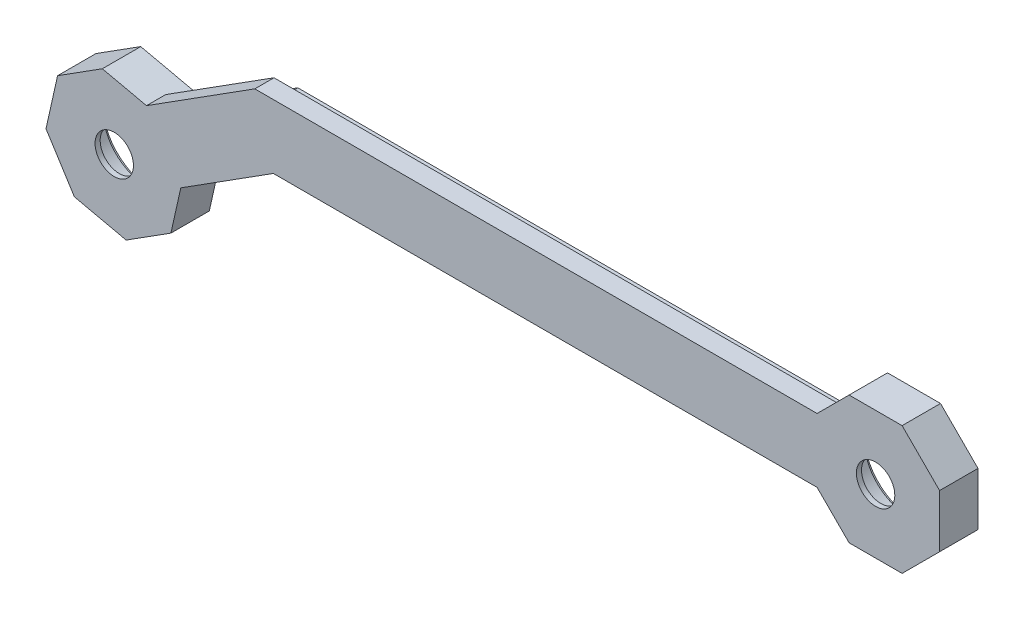
ISO-10303-21;
HEADER;
FILE_DESCRIPTION(('STEP AP214'),'2;1');
FILE_NAME('part.step','',(''),(''),'','','');
FILE_SCHEMA(('AUTOMOTIVE_DESIGN { 1 0 10303 214 1 1 1 1 }'));
ENDSEC;
DATA;
#1=APPLICATION_CONTEXT('core data for automotive mechanical design processes');
#2=APPLICATION_PROTOCOL_DEFINITION('international standard','automotive_design',2000,#1);
#3=PRODUCT_CONTEXT('',#1,'mechanical');
#4=PRODUCT('Part','Part','',(#3));
#5=PRODUCT_RELATED_PRODUCT_CATEGORY('part','',(#4));
#6=PRODUCT_DEFINITION_FORMATION('','',#4);
#7=PRODUCT_DEFINITION_CONTEXT('part definition',#1,'design');
#8=PRODUCT_DEFINITION('design','',#6,#7);
#9=PRODUCT_DEFINITION_SHAPE('','',#8);
#10=(LENGTH_UNIT() NAMED_UNIT(*) SI_UNIT(.MILLI.,.METRE.));
#11=(NAMED_UNIT(*) PLANE_ANGLE_UNIT() SI_UNIT($,.RADIAN.));
#12=(NAMED_UNIT(*) SI_UNIT($,.STERADIAN.) SOLID_ANGLE_UNIT());
#13=UNCERTAINTY_MEASURE_WITH_UNIT(LENGTH_MEASURE(1.E-05),#10,'distance_accuracy_value','');
#14=(GEOMETRIC_REPRESENTATION_CONTEXT(3) GLOBAL_UNCERTAINTY_ASSIGNED_CONTEXT((#13)) GLOBAL_UNIT_ASSIGNED_CONTEXT((#10,
#11,#12)) REPRESENTATION_CONTEXT('',''));
#15=CARTESIAN_POINT('',(0.,0.,0.));
#16=DIRECTION('',(0.,0.,1.));
#17=DIRECTION('',(1.,0.,0.));
#18=AXIS2_PLACEMENT_3D('',#15,#16,#17);
#19=CARTESIAN_POINT('',(-118.966411787134,-14.8547745204735,-6.));
#20=DIRECTION('',(0.,0.,1.));
#21=DIRECTION('',(1.,0.,0.));
#22=AXIS2_PLACEMENT_3D('',#19,#20,#21);
#23=CYLINDRICAL_SURFACE('',#22,3.00000000000001);
#24=CARTESIAN_POINT('',(-118.966411787134,-14.8547745204735,0.));
#25=DIRECTION('',(0.,0.,1.));
#26=DIRECTION('',(1.,0.,0.));
#27=AXIS2_PLACEMENT_3D('',#24,#25,#26);
#28=CIRCLE('',#27,3.00000000000001);
#29=CARTESIAN_POINT('',(-115.966411787134,-14.8547745204735,0.));
#30=VERTEX_POINT('',#29);
#31=EDGE_CURVE('E287',#30,#30,#28,.T.);
#32=ORIENTED_EDGE('',*,*,#31,.T.);
#33=EDGE_LOOP('',(#32));
#34=FACE_BOUND('',#33,.T.);
#35=CARTESIAN_POINT('',(-118.966411787134,-14.8547745204735,-0.8));
#36=DIRECTION('',(0.,0.,-1.));
#37=DIRECTION('',(-1.,0.,0.));
#38=AXIS2_PLACEMENT_3D('',#35,#36,#37);
#39=CIRCLE('',#38,3.00000000000001);
#40=CARTESIAN_POINT('',(-121.966411787134,-14.8547745204735,-0.8));
#41=VERTEX_POINT('',#40);
#42=EDGE_CURVE('E44',#41,#41,#39,.F.);
#43=ORIENTED_EDGE('',*,*,#42,.F.);
#44=EDGE_LOOP('',(#43));
#45=FACE_BOUND('',#44,.T.);
#46=ADVANCED_FACE('F41',(#34,#45),#23,.F.);
#47=CARTESIAN_POINT('',(-26.0791075677496,41.1099556580758,-6.));
#48=DIRECTION('',(-0.535679423795971,0.844421432059618,0.));
#49=DIRECTION('',(-0.844421432059618,-0.535679423795971,0.));
#50=AXIS2_PLACEMENT_3D('',#47,#48,#49);
#51=PLANE('',#50);
#52=DIRECTION('',(-0.844421432059618,-0.535679423795971,0.));
#53=VECTOR('',#52,1.);
#54=CARTESIAN_POINT('',(-107.79634439202,-10.7293755979477,-3.));
#55=LINE('',#54,#53);
#56=CARTESIAN_POINT('',(-94.8239194328302,-2.50000000000002,-3.));
#57=VERTEX_POINT('',#56);
#58=CARTESIAN_POINT('',(-107.79634439202,-10.7293755979477,-3.));
#59=VERTEX_POINT('',#58);
#60=EDGE_CURVE('E65',#57,#59,#55,.T.);
#61=ORIENTED_EDGE('',*,*,#60,.T.);
#62=DIRECTION('',(0.,0.,1.));
#63=VECTOR('',#62,1.);
#64=CARTESIAN_POINT('',(-107.79634439202,-10.7293755979477,-6.));
#65=LINE('',#64,#63);
#66=CARTESIAN_POINT('',(-107.79634439202,-10.7293755979477,-6.));
#67=VERTEX_POINT('',#66);
#68=EDGE_CURVE('E11',#67,#59,#65,.T.);
#69=ORIENTED_EDGE('',*,*,#68,.F.);
#70=DIRECTION('',(-0.844421432059618,-0.535679423795971,0.));
#71=VECTOR('',#70,1.);
#72=CARTESIAN_POINT('',(-26.0791075677496,41.1099556580758,-6.));
#73=LINE('',#72,#71);
#74=CARTESIAN_POINT('',(-94.8239194328302,-2.50000000000002,-6.));
#75=VERTEX_POINT('',#74);
#76=EDGE_CURVE('E294',#75,#67,#73,.T.);
#77=ORIENTED_EDGE('',*,*,#76,.F.);
#78=DIRECTION('',(0.,0.,1.));
#79=VECTOR('',#78,1.);
#80=CARTESIAN_POINT('',(-94.8239194328302,-2.50000000000002,-6.));
#81=LINE('',#80,#79);
#82=EDGE_CURVE('E363',#75,#57,#81,.T.);
#83=ORIENTED_EDGE('',*,*,#82,.T.);
#84=EDGE_LOOP('',(#61,#69,#77,#83));
#85=FACE_BOUND('',#84,.T.);
#86=ADVANCED_FACE('F541',(#85),#51,.F.);
#87=CARTESIAN_POINT('',(0.,-2.5,-6.));
#88=DIRECTION('',(0.,1.,0.));
#89=DIRECTION('',(-1.,0.,0.));
#90=AXIS2_PLACEMENT_3D('',#87,#88,#89);
#91=PLANE('',#90);
#92=DIRECTION('',(-1.,0.,0.));
#93=VECTOR('',#92,1.);
#94=CARTESIAN_POINT('',(-94.8239194328302,-2.50000000000001,-3.));
#95=LINE('',#94,#93);
#96=CARTESIAN_POINT('',(-11.6421356237309,-2.5,-3.));
#97=VERTEX_POINT('',#96);
#98=EDGE_CURVE('E241',#97,#57,#95,.T.);
#99=ORIENTED_EDGE('',*,*,#98,.T.);
#100=ORIENTED_EDGE('',*,*,#82,.F.);
#101=DIRECTION('',(-1.,0.,0.));
#102=VECTOR('',#101,1.);
#103=CARTESIAN_POINT('',(0.,-2.5,-6.));
#104=LINE('',#103,#102);
#105=CARTESIAN_POINT('',(-11.6421356237309,-2.5,-6.));
#106=VERTEX_POINT('',#105);
#107=EDGE_CURVE('E297',#106,#75,#104,.T.);
#108=ORIENTED_EDGE('',*,*,#107,.F.);
#109=DIRECTION('',(0.,0.,1.));
#110=VECTOR('',#109,1.);
#111=CARTESIAN_POINT('',(-11.6421356237309,-2.5,-6.));
#112=LINE('',#111,#110);
#113=EDGE_CURVE('E467',#106,#97,#112,.T.);
#114=ORIENTED_EDGE('',*,*,#113,.T.);
#115=EDGE_LOOP('',(#99,#100,#108,#114));
#116=FACE_BOUND('',#115,.T.);
#117=ADVANCED_FACE('F545',(#116),#91,.F.);
#118=CARTESIAN_POINT('',(-28.7575046867299,45.3320628183741,-6.));
#119=DIRECTION('',(-0.535679423795975,0.844421432059616,0.));
#120=DIRECTION('',(-0.844421432059616,-0.535679423795975,0.));
#121=AXIS2_PLACEMENT_3D('',#118,#119,#120);
#122=PLANE('',#121);
#123=DIRECTION('',(0.,0.,1.));
#124=VECTOR('',#123,1.);
#125=CARTESIAN_POINT('',(-110.474741511,-6.50726843764966,-6.));
#126=LINE('',#125,#124);
#127=CARTESIAN_POINT('',(-110.474741511,-6.50726843764966,-6.));
#128=VERTEX_POINT('',#127);
#129=CARTESIAN_POINT('',(-110.474741511,-6.50726843764966,-3.));
#130=VERTEX_POINT('',#129);
#131=EDGE_CURVE('E437',#128,#130,#126,.T.);
#132=ORIENTED_EDGE('',*,*,#131,.T.);
#133=DIRECTION('',(0.844421432059616,0.535679423795975,0.));
#134=VECTOR('',#133,1.);
#135=CARTESIAN_POINT('',(-110.474741511,-6.50726843764966,-3.));
#136=LINE('',#135,#134);
#137=CARTESIAN_POINT('',(-96.2760805671698,2.49999999999999,-3.));
#138=VERTEX_POINT('',#137);
#139=EDGE_CURVE('E264',#130,#138,#136,.T.);
#140=ORIENTED_EDGE('',*,*,#139,.T.);
#141=DIRECTION('',(0.,0.,1.));
#142=VECTOR('',#141,1.);
#143=CARTESIAN_POINT('',(-96.2760805671698,2.49999999999999,-6.));
#144=LINE('',#143,#142);
#145=CARTESIAN_POINT('',(-96.2760805671698,2.49999999999999,-6.));
#146=VERTEX_POINT('',#145);
#147=EDGE_CURVE('E441',#146,#138,#144,.T.);
#148=ORIENTED_EDGE('',*,*,#147,.F.);
#149=DIRECTION('',(-0.844421432059616,-0.535679423795976,0.));
#150=VECTOR('',#149,1.);
#151=CARTESIAN_POINT('',(-28.7575046867299,45.3320628183741,-6.));
#152=LINE('',#151,#150);
#153=EDGE_CURVE('E332',#146,#128,#152,.T.);
#154=ORIENTED_EDGE('',*,*,#153,.T.);
#155=EDGE_LOOP('',(#132,#140,#148,#154));
#156=FACE_BOUND('',#155,.T.);
#157=ADVANCED_FACE('F549',(#156),#122,.T.);
#158=CARTESIAN_POINT('',(0.,2.5,-6.));
#159=DIRECTION('',(0.,1.,0.));
#160=DIRECTION('',(-1.,0.,0.));
#161=AXIS2_PLACEMENT_3D('',#158,#159,#160);
#162=PLANE('',#161);
#163=ORIENTED_EDGE('',*,*,#147,.T.);
#164=DIRECTION('',(1.,0.,0.));
#165=VECTOR('',#164,1.);
#166=CARTESIAN_POINT('',(-96.2760805671698,2.49999999999999,-3.));
#167=LINE('',#166,#165);
#168=CARTESIAN_POINT('',(-11.6421356237309,2.5,-3.));
#169=VERTEX_POINT('',#168);
#170=EDGE_CURVE('E267',#138,#169,#167,.T.);
#171=ORIENTED_EDGE('',*,*,#170,.T.);
#172=DIRECTION('',(0.,0.,1.));
#173=VECTOR('',#172,1.);
#174=CARTESIAN_POINT('',(-11.6421356237309,2.5,-6.));
#175=LINE('',#174,#173);
#176=CARTESIAN_POINT('',(-11.6421356237309,2.5,-6.));
#177=VERTEX_POINT('',#176);
#178=EDGE_CURVE('E445',#177,#169,#175,.T.);
#179=ORIENTED_EDGE('',*,*,#178,.F.);
#180=DIRECTION('',(-1.,0.,0.));
#181=VECTOR('',#180,1.);
#182=CARTESIAN_POINT('',(0.,2.5,-6.));
#183=LINE('',#182,#181);
#184=EDGE_CURVE('E328',#177,#146,#183,.T.);
#185=ORIENTED_EDGE('',*,*,#184,.T.);
#186=EDGE_LOOP('',(#163,#171,#179,#185));
#187=FACE_BOUND('',#186,.T.);
#188=ADVANCED_FACE('F582',(#187),#162,.T.);
#189=CARTESIAN_POINT('',(-100.372815653061,22.4543768292855,-6.));
#190=DIRECTION('',(0.975878673896848,-0.218313567680365,0.));
#191=DIRECTION('',(0.218313567680365,0.975878673896848,0.));
#192=AXIS2_PLACEMENT_3D('',#189,#190,#191);
#193=PLANE('',#192);
#194=DIRECTION('',(0.,0.,1.));
#195=VECTOR('',#194,1.);
#196=CARTESIAN_POINT('',(-108.56819941268,-14.1796277375867,-3.));
#197=LINE('',#196,#195);
#198=CARTESIAN_POINT('',(-108.56819941268,-14.1796277375867,-3.));
#199=VERTEX_POINT('',#198);
#200=CARTESIAN_POINT('',(-108.56819941268,-14.1796277375867,0.));
#201=VERTEX_POINT('',#200);
#202=EDGE_CURVE('E229',#199,#201,#197,.T.);
#203=ORIENTED_EDGE('',*,*,#202,.T.);
#204=DIRECTION('',(0.218313567680365,0.975878673896848,0.));
#205=VECTOR('',#204,1.);
#206=CARTESIAN_POINT('',(-100.372815653061,22.4543768292855,0.));
#207=LINE('',#206,#205);
#208=CARTESIAN_POINT('',(-110.111909453998,-21.0801320168647,0.));
#209=VERTEX_POINT('',#208);
#210=EDGE_CURVE('E298',#209,#201,#207,.T.);
#211=ORIENTED_EDGE('',*,*,#210,.F.);
#212=DIRECTION('',(0.,0.,1.));
#213=VECTOR('',#212,1.);
#214=CARTESIAN_POINT('',(-110.111909453998,-21.0801320168647,-6.));
#215=LINE('',#214,#213);
#216=CARTESIAN_POINT('',(-110.111909453998,-21.0801320168647,-6.));
#217=VERTEX_POINT('',#216);
#218=EDGE_CURVE('E50',#217,#209,#215,.T.);
#219=ORIENTED_EDGE('',*,*,#218,.F.);
#220=DIRECTION('',(0.218313567680365,0.975878673896848,0.));
#221=VECTOR('',#220,1.);
#222=CARTESIAN_POINT('',(-100.372815653061,22.4543768292855,-6.));
#223=LINE('',#222,#221);
#224=EDGE_CURVE('E359',#217,#67,#223,.T.);
#225=ORIENTED_EDGE('',*,*,#224,.T.);
#226=ORIENTED_EDGE('',*,*,#68,.T.);
#227=DIRECTION('',(-0.218313567680386,-0.975878673896843,0.));
#228=VECTOR('',#227,1.);
#229=CARTESIAN_POINT('',(-108.56819941268,-14.1796277375867,-3.));
#230=LINE('',#229,#228);
#231=EDGE_CURVE('E57',#59,#199,#230,.T.);
#232=ORIENTED_EDGE('',*,*,#231,.T.);
#233=EDGE_LOOP('',(#203,#211,#219,#225,#226,#232));
#234=FACE_BOUND('',#233,.T.);
#235=ADVANCED_FACE('F585',(#234),#193,.T.);
#236=CARTESIAN_POINT('',(-22.0615118892795,34.7767949176284,-6.));
#237=DIRECTION('',(0.535679423795969,-0.84442143205962,0.));
#238=DIRECTION('',(0.84442143205962,0.535679423795969,0.));
#239=AXIS2_PLACEMENT_3D('',#236,#237,#238);
#240=PLANE('',#239);
#241=DIRECTION('',(0.84442143205962,0.535679423795969,0.));
#242=VECTOR('',#241,1.);
#243=CARTESIAN_POINT('',(-22.0615118892795,34.7767949176284,0.));
#244=LINE('',#243,#242);
#245=CARTESIAN_POINT('',(-117.10732564435,-25.5178456652746,0.));
#246=VERTEX_POINT('',#245);
#247=EDGE_CURVE('E413',#246,#209,#244,.T.);
#248=ORIENTED_EDGE('',*,*,#247,.F.);
#249=DIRECTION('',(0.,0.,1.));
#250=VECTOR('',#249,1.);
#251=CARTESIAN_POINT('',(-117.10732564435,-25.5178456652746,-6.));
#252=LINE('',#251,#250);
#253=CARTESIAN_POINT('',(-117.10732564435,-25.5178456652746,-6.));
#254=VERTEX_POINT('',#253);
#255=EDGE_CURVE('E422',#254,#246,#252,.T.);
#256=ORIENTED_EDGE('',*,*,#255,.F.);
#257=DIRECTION('',(0.84442143205962,0.535679423795969,0.));
#258=VECTOR('',#257,1.);
#259=CARTESIAN_POINT('',(-22.0615118892795,34.7767949176284,-6.));
#260=LINE('',#259,#258);
#261=EDGE_CURVE('E355',#254,#217,#260,.T.);
#262=ORIENTED_EDGE('',*,*,#261,.T.);
#263=ORIENTED_EDGE('',*,*,#218,.T.);
#264=EDGE_LOOP('',(#248,#256,#262,#263));
#265=FACE_BOUND('',#264,.T.);
#266=ADVANCED_FACE('F608',(#265),#240,.T.);
#267=CARTESIAN_POINT('',(-11.0179450719085,-49.2510737655318,-6.));
#268=DIRECTION('',(-0.218313567680371,-0.975878673896847,0.));
#269=DIRECTION('',(0.975878673896847,-0.218313567680371,0.));
#270=AXIS2_PLACEMENT_3D('',#267,#268,#269);
#271=PLANE('',#270);
#272=DIRECTION('',(0.975878673896847,-0.218313567680371,0.));
#273=VECTOR('',#272,1.);
#274=CARTESIAN_POINT('',(-11.0179450719085,-49.2510737655318,0.));
#275=LINE('',#274,#273);
#276=CARTESIAN_POINT('',(-125.191769283525,-23.7092768536093,0.));
#277=VERTEX_POINT('',#276);
#278=EDGE_CURVE('E409',#277,#246,#275,.T.);
#279=ORIENTED_EDGE('',*,*,#278,.F.);
#280=DIRECTION('',(0.,0.,1.));
#281=VECTOR('',#280,1.);
#282=CARTESIAN_POINT('',(-125.191769283525,-23.7092768536093,-6.));
#283=LINE('',#282,#281);
#284=CARTESIAN_POINT('',(-125.191769283525,-23.7092768536093,-6.));
#285=VERTEX_POINT('',#284);
#286=EDGE_CURVE('E425',#285,#277,#283,.T.);
#287=ORIENTED_EDGE('',*,*,#286,.F.);
#288=DIRECTION('',(0.975878673896847,-0.218313567680371,0.));
#289=VECTOR('',#288,1.);
#290=CARTESIAN_POINT('',(-11.0179450719085,-49.2510737655318,-6.));
#291=LINE('',#290,#289);
#292=EDGE_CURVE('E351',#285,#254,#291,.T.);
#293=ORIENTED_EDGE('',*,*,#292,.T.);
#294=ORIENTED_EDGE('',*,*,#255,.T.);
#295=EDGE_LOOP('',(#279,#287,#293,#294));
#296=FACE_BOUND('',#295,.T.);
#297=ADVANCED_FACE('F604',(#296),#271,.T.);
#298=CARTESIAN_POINT('',(-99.9923199804895,-63.4325779966584,-6.));
#299=DIRECTION('',(-0.844421432059615,-0.535679423795976,0.));
#300=DIRECTION('',(0.535679423795977,-0.844421432059615,0.));
#301=AXIS2_PLACEMENT_3D('',#298,#299,#300);
#302=PLANE('',#301);
#303=DIRECTION('',(0.535679423795976,-0.844421432059615,0.));
#304=VECTOR('',#303,1.);
#305=CARTESIAN_POINT('',(-99.9923199804895,-63.4325779966584,0.));
#306=LINE('',#305,#304);
#307=CARTESIAN_POINT('',(-129.629482931935,-16.7138606632572,0.));
#308=VERTEX_POINT('',#307);
#309=EDGE_CURVE('E405',#308,#277,#306,.T.);
#310=ORIENTED_EDGE('',*,*,#309,.F.);
#311=DIRECTION('',(0.,0.,1.));
#312=VECTOR('',#311,1.);
#313=CARTESIAN_POINT('',(-129.629482931935,-16.7138606632572,-6.));
#314=LINE('',#313,#312);
#315=CARTESIAN_POINT('',(-129.629482931935,-16.7138606632572,-6.));
#316=VERTEX_POINT('',#315);
#317=EDGE_CURVE('E428',#316,#308,#314,.T.);
#318=ORIENTED_EDGE('',*,*,#317,.F.);
#319=DIRECTION('',(0.535679423795976,-0.844421432059615,0.));
#320=VECTOR('',#319,1.);
#321=CARTESIAN_POINT('',(-99.9923199804895,-63.4325779966584,-6.));
#322=LINE('',#321,#320);
#323=EDGE_CURVE('E347',#316,#285,#322,.T.);
#324=ORIENTED_EDGE('',*,*,#323,.T.);
#325=ORIENTED_EDGE('',*,*,#286,.T.);
#326=EDGE_LOOP('',(#310,#318,#324,#325));
#327=FACE_BOUND('',#326,.T.);
#328=ADVANCED_FACE('F600',(#327),#302,.T.);
#329=CARTESIAN_POINT('',(-119.890389130997,26.8206481828934,-6.));
#330=DIRECTION('',(-0.975878673896847,0.21831356768037,0.));
#331=DIRECTION('',(-0.21831356768037,-0.975878673896847,0.));
#332=AXIS2_PLACEMENT_3D('',#329,#330,#331);
#333=PLANE('',#332);
#334=DIRECTION('',(-0.21831356768037,-0.975878673896847,0.));
#335=VECTOR('',#334,1.);
#336=CARTESIAN_POINT('',(-119.890389130997,26.8206481828934,0.));
#337=LINE('',#336,#335);
#338=CARTESIAN_POINT('',(-127.820914120269,-8.62941702408226,0.));
#339=VERTEX_POINT('',#338);
#340=EDGE_CURVE('E401',#339,#308,#337,.T.);
#341=ORIENTED_EDGE('',*,*,#340,.F.);
#342=DIRECTION('',(0.,0.,1.));
#343=VECTOR('',#342,1.);
#344=CARTESIAN_POINT('',(-127.820914120269,-8.62941702408226,-6.));
#345=LINE('',#344,#343);
#346=CARTESIAN_POINT('',(-127.820914120269,-8.62941702408226,-6.));
#347=VERTEX_POINT('',#346);
#348=EDGE_CURVE('E431',#347,#339,#345,.T.);
#349=ORIENTED_EDGE('',*,*,#348,.F.);
#350=DIRECTION('',(-0.21831356768037,-0.975878673896847,0.));
#351=VECTOR('',#350,1.);
#352=CARTESIAN_POINT('',(-119.890389130997,26.8206481828934,-6.));
#353=LINE('',#352,#351);
#354=EDGE_CURVE('E343',#347,#316,#353,.T.);
#355=ORIENTED_EDGE('',*,*,#354,.T.);
#356=ORIENTED_EDGE('',*,*,#317,.T.);
#357=EDGE_LOOP('',(#341,#349,#355,#356));
#358=FACE_BOUND('',#357,.T.);
#359=ADVANCED_FACE('F596',(#358),#333,.T.);
#360=CARTESIAN_POINT('',(-32.7751003651998,51.6652235588213,-6.));
#361=DIRECTION('',(-0.535679423795975,0.844421432059615,0.));
#362=DIRECTION('',(-0.844421432059616,-0.535679423795975,0.));
#363=AXIS2_PLACEMENT_3D('',#360,#361,#362);
#364=PLANE('',#363);
#365=DIRECTION('',(-0.844421432059616,-0.535679423795975,0.));
#366=VECTOR('',#365,1.);
#367=CARTESIAN_POINT('',(-32.7751003651998,51.6652235588213,0.));
#368=LINE('',#367,#366);
#369=CARTESIAN_POINT('',(-120.825497929917,-4.19170337567234,0.));
#370=VERTEX_POINT('',#369);
#371=EDGE_CURVE('E397',#370,#339,#368,.T.);
#372=ORIENTED_EDGE('',*,*,#371,.F.);
#373=DIRECTION('',(0.,0.,1.));
#374=VECTOR('',#373,1.);
#375=CARTESIAN_POINT('',(-120.825497929917,-4.19170337567234,-6.));
#376=LINE('',#375,#374);
#377=CARTESIAN_POINT('',(-120.825497929917,-4.19170337567234,-6.));
#378=VERTEX_POINT('',#377);
#379=EDGE_CURVE('E434',#378,#370,#376,.T.);
#380=ORIENTED_EDGE('',*,*,#379,.F.);
#381=DIRECTION('',(-0.844421432059616,-0.535679423795975,0.));
#382=VECTOR('',#381,1.);
#383=CARTESIAN_POINT('',(-32.7751003651998,51.6652235588213,-6.));
#384=LINE('',#383,#382);
#385=EDGE_CURVE('E339',#378,#347,#384,.T.);
#386=ORIENTED_EDGE('',*,*,#385,.T.);
#387=ORIENTED_EDGE('',*,*,#348,.T.);
#388=EDGE_LOOP('',(#372,#380,#386,#387));
#389=FACE_BOUND('',#388,.T.);
#390=ADVANCED_FACE('F592',(#389),#364,.T.);
#391=CARTESIAN_POINT('',(-6.65167371830106,-29.7335002875948,-6.));
#392=DIRECTION('',(-0.218313567680371,-0.975878673896847,0.));
#393=DIRECTION('',(0.975878673896847,-0.218313567680371,0.));
#394=AXIS2_PLACEMENT_3D('',#391,#392,#393);
#395=PLANE('',#394);
#396=DIRECTION('',(0.975878673896847,-0.218313567680371,0.));
#397=VECTOR('',#396,1.);
#398=CARTESIAN_POINT('',(-6.65167371830106,-29.7335002875948,0.));
#399=LINE('',#398,#397);
#400=CARTESIAN_POINT('',(-113.924993650639,-5.73541341699053,0.));
#401=VERTEX_POINT('',#400);
#402=EDGE_CURVE('E394',#370,#401,#399,.T.);
#403=ORIENTED_EDGE('',*,*,#402,.T.);
#404=DIRECTION('',(0.,0.,1.));
#405=VECTOR('',#404,1.);
#406=CARTESIAN_POINT('',(-113.924993650639,-5.7354134169905,-3.));
#407=LINE('',#406,#405);
#408=CARTESIAN_POINT('',(-113.924993650639,-5.73541341699053,-3.));
#409=VERTEX_POINT('',#408);
#410=EDGE_CURVE('E277',#409,#401,#407,.T.);
#411=ORIENTED_EDGE('',*,*,#410,.F.);
#412=DIRECTION('',(0.975878673896845,-0.218313567680379,0.));
#413=VECTOR('',#412,1.);
#414=CARTESIAN_POINT('',(-113.924993650639,-5.7354134169905,-3.));
#415=LINE('',#414,#413);
#416=EDGE_CURVE('E260',#409,#130,#415,.T.);
#417=ORIENTED_EDGE('',*,*,#416,.T.);
#418=ORIENTED_EDGE('',*,*,#131,.F.);
#419=DIRECTION('',(0.975878673896847,-0.218313567680371,0.));
#420=VECTOR('',#419,1.);
#421=CARTESIAN_POINT('',(-6.65167371830106,-29.7335002875948,-6.));
#422=LINE('',#421,#420);
#423=EDGE_CURVE('E336',#378,#128,#422,.T.);
#424=ORIENTED_EDGE('',*,*,#423,.F.);
#425=ORIENTED_EDGE('',*,*,#379,.T.);
#426=EDGE_LOOP('',(#403,#411,#417,#418,#424,#425));
#427=FACE_BOUND('',#426,.T.);
#428=ADVANCED_FACE('F580',(#427),#395,.F.);
#429=CARTESIAN_POINT('',(-7.07106781186547,7.07106781186547,-6.));
#430=DIRECTION('',(-0.707106781186547,0.707106781186547,0.));
#431=DIRECTION('',(-0.707106781186548,-0.707106781186548,0.));
#432=AXIS2_PLACEMENT_3D('',#429,#430,#431);
#433=PLANE('',#432);
#434=DIRECTION('',(0.,0.,1.));
#435=VECTOR('',#434,1.);
#436=CARTESIAN_POINT('',(-9.14213562373094,5.00000000000001,-3.));
#437=LINE('',#436,#435);
#438=CARTESIAN_POINT('',(-9.14213562373094,5.,-3.));
#439=VERTEX_POINT('',#438);
#440=CARTESIAN_POINT('',(-9.14213562373093,5.,0.));
#441=VERTEX_POINT('',#440);
#442=EDGE_CURVE('E288',#439,#441,#437,.T.);
#443=ORIENTED_EDGE('',*,*,#442,.T.);
#444=DIRECTION('',(-0.707106781186548,-0.707106781186548,0.));
#445=VECTOR('',#444,1.);
#446=CARTESIAN_POINT('',(-7.07106781186547,7.07106781186547,0.));
#447=LINE('',#446,#445);
#448=CARTESIAN_POINT('',(-4.14213562373094,9.99999999999999,0.));
#449=VERTEX_POINT('',#448);
#450=EDGE_CURVE('E390',#449,#441,#447,.T.);
#451=ORIENTED_EDGE('',*,*,#450,.F.);
#452=DIRECTION('',(0.,0.,1.));
#453=VECTOR('',#452,1.);
#454=CARTESIAN_POINT('',(-4.14213562373094,9.99999999999999,-6.));
#455=LINE('',#454,#453);
#456=CARTESIAN_POINT('',(-4.14213562373094,9.99999999999999,-6.));
#457=VERTEX_POINT('',#456);
#458=EDGE_CURVE('E449',#457,#449,#455,.T.);
#459=ORIENTED_EDGE('',*,*,#458,.F.);
#460=DIRECTION('',(-0.707106781186548,-0.707106781186548,0.));
#461=VECTOR('',#460,1.);
#462=CARTESIAN_POINT('',(-7.07106781186547,7.07106781186547,-6.));
#463=LINE('',#462,#461);
#464=EDGE_CURVE('E324',#457,#177,#463,.T.);
#465=ORIENTED_EDGE('',*,*,#464,.T.);
#466=ORIENTED_EDGE('',*,*,#178,.T.);
#467=DIRECTION('',(0.707106781186546,0.707106781186549,0.));
#468=VECTOR('',#467,1.);
#469=CARTESIAN_POINT('',(-11.6421356237309,2.5,-3.));
#470=LINE('',#469,#468);
#471=EDGE_CURVE('E270',#169,#439,#470,.T.);
#472=ORIENTED_EDGE('',*,*,#471,.T.);
#473=EDGE_LOOP('',(#443,#451,#459,#465,#466,#472));
#474=FACE_BOUND('',#473,.T.);
#475=ADVANCED_FACE('F576',(#474),#433,.T.);
#476=CARTESIAN_POINT('',(0.,9.99999999999999,-6.));
#477=DIRECTION('',(0.,1.,0.));
#478=DIRECTION('',(-1.,0.,0.));
#479=AXIS2_PLACEMENT_3D('',#476,#477,#478);
#480=PLANE('',#479);
#481=DIRECTION('',(-1.,0.,0.));
#482=VECTOR('',#481,1.);
#483=CARTESIAN_POINT('',(0.,9.99999999999999,0.));
#484=LINE('',#483,#482);
#485=CARTESIAN_POINT('',(4.14213562373095,9.99999999999999,0.));
#486=VERTEX_POINT('',#485);
#487=EDGE_CURVE('E386',#486,#449,#484,.T.);
#488=ORIENTED_EDGE('',*,*,#487,.F.);
#489=DIRECTION('',(0.,0.,1.));
#490=VECTOR('',#489,1.);
#491=CARTESIAN_POINT('',(4.14213562373095,9.99999999999999,-6.));
#492=LINE('',#491,#490);
#493=CARTESIAN_POINT('',(4.14213562373095,9.99999999999999,-6.));
#494=VERTEX_POINT('',#493);
#495=EDGE_CURVE('E452',#494,#486,#492,.T.);
#496=ORIENTED_EDGE('',*,*,#495,.F.);
#497=DIRECTION('',(-1.,0.,0.));
#498=VECTOR('',#497,1.);
#499=CARTESIAN_POINT('',(0.,9.99999999999999,-6.));
#500=LINE('',#499,#498);
#501=EDGE_CURVE('E320',#494,#457,#500,.T.);
#502=ORIENTED_EDGE('',*,*,#501,.T.);
#503=ORIENTED_EDGE('',*,*,#458,.T.);
#504=EDGE_LOOP('',(#488,#496,#502,#503));
#505=FACE_BOUND('',#504,.T.);
#506=ADVANCED_FACE('F572',(#505),#480,.T.);
#507=CARTESIAN_POINT('',(7.07106781186547,7.07106781186547,-6.));
#508=DIRECTION('',(0.707106781186548,0.707106781186547,0.));
#509=DIRECTION('',(-0.707106781186547,0.707106781186548,0.));
#510=AXIS2_PLACEMENT_3D('',#507,#508,#509);
#511=PLANE('',#510);
#512=DIRECTION('',(-0.707106781186547,0.707106781186548,0.));
#513=VECTOR('',#512,1.);
#514=CARTESIAN_POINT('',(7.07106781186547,7.07106781186547,0.));
#515=LINE('',#514,#513);
#516=CARTESIAN_POINT('',(10.,4.14213562373094,0.));
#517=VERTEX_POINT('',#516);
#518=EDGE_CURVE('E382',#517,#486,#515,.T.);
#519=ORIENTED_EDGE('',*,*,#518,.F.);
#520=DIRECTION('',(0.,0.,1.));
#521=VECTOR('',#520,1.);
#522=CARTESIAN_POINT('',(10.,4.14213562373094,-6.));
#523=LINE('',#522,#521);
#524=CARTESIAN_POINT('',(10.,4.14213562373094,-6.));
#525=VERTEX_POINT('',#524);
#526=EDGE_CURVE('E455',#525,#517,#523,.T.);
#527=ORIENTED_EDGE('',*,*,#526,.F.);
#528=DIRECTION('',(-0.707106781186547,0.707106781186548,0.));
#529=VECTOR('',#528,1.);
#530=CARTESIAN_POINT('',(7.07106781186547,7.07106781186547,-6.));
#531=LINE('',#530,#529);
#532=EDGE_CURVE('E316',#525,#494,#531,.T.);
#533=ORIENTED_EDGE('',*,*,#532,.T.);
#534=ORIENTED_EDGE('',*,*,#495,.T.);
#535=EDGE_LOOP('',(#519,#527,#533,#534));
#536=FACE_BOUND('',#535,.T.);
#537=ADVANCED_FACE('F568',(#536),#511,.T.);
#538=CARTESIAN_POINT('',(10.,0.,-6.));
#539=DIRECTION('',(1.,0.,0.));
#540=DIRECTION('',(0.,1.,0.));
#541=AXIS2_PLACEMENT_3D('',#538,#539,#540);
#542=PLANE('',#541);
#543=DIRECTION('',(0.,1.,0.));
#544=VECTOR('',#543,1.);
#545=CARTESIAN_POINT('',(10.,0.,0.));
#546=LINE('',#545,#544);
#547=CARTESIAN_POINT('',(10.,-4.14213562373095,0.));
#548=VERTEX_POINT('',#547);
#549=EDGE_CURVE('E378',#548,#517,#546,.T.);
#550=ORIENTED_EDGE('',*,*,#549,.F.);
#551=DIRECTION('',(0.,0.,1.));
#552=VECTOR('',#551,1.);
#553=CARTESIAN_POINT('',(10.,-4.14213562373095,-6.));
#554=LINE('',#553,#552);
#555=CARTESIAN_POINT('',(10.,-4.14213562373095,-6.));
#556=VERTEX_POINT('',#555);
#557=EDGE_CURVE('E458',#556,#548,#554,.T.);
#558=ORIENTED_EDGE('',*,*,#557,.F.);
#559=DIRECTION('',(0.,1.,0.));
#560=VECTOR('',#559,1.);
#561=CARTESIAN_POINT('',(10.,0.,-6.));
#562=LINE('',#561,#560);
#563=EDGE_CURVE('E312',#556,#525,#562,.T.);
#564=ORIENTED_EDGE('',*,*,#563,.T.);
#565=ORIENTED_EDGE('',*,*,#526,.T.);
#566=EDGE_LOOP('',(#550,#558,#564,#565));
#567=FACE_BOUND('',#566,.T.);
#568=ADVANCED_FACE('F564',(#567),#542,.T.);
#569=CARTESIAN_POINT('',(7.07106781186547,-7.07106781186548,-6.));
#570=DIRECTION('',(0.707106781186547,-0.707106781186548,0.));
#571=DIRECTION('',(0.707106781186548,0.707106781186547,0.));
#572=AXIS2_PLACEMENT_3D('',#569,#570,#571);
#573=PLANE('',#572);
#574=DIRECTION('',(0.707106781186548,0.707106781186547,0.));
#575=VECTOR('',#574,1.);
#576=CARTESIAN_POINT('',(7.07106781186547,-7.07106781186548,0.));
#577=LINE('',#576,#575);
#578=CARTESIAN_POINT('',(4.14213562373095,-10.,0.));
#579=VERTEX_POINT('',#578);
#580=EDGE_CURVE('E374',#579,#548,#577,.T.);
#581=ORIENTED_EDGE('',*,*,#580,.F.);
#582=DIRECTION('',(0.,0.,1.));
#583=VECTOR('',#582,1.);
#584=CARTESIAN_POINT('',(4.14213562373095,-10.,-6.));
#585=LINE('',#584,#583);
#586=CARTESIAN_POINT('',(4.14213562373095,-10.,-6.));
#587=VERTEX_POINT('',#586);
#588=EDGE_CURVE('E461',#587,#579,#585,.T.);
#589=ORIENTED_EDGE('',*,*,#588,.F.);
#590=DIRECTION('',(0.707106781186548,0.707106781186547,0.));
#591=VECTOR('',#590,1.);
#592=CARTESIAN_POINT('',(7.07106781186547,-7.07106781186548,-6.));
#593=LINE('',#592,#591);
#594=EDGE_CURVE('E308',#587,#556,#593,.T.);
#595=ORIENTED_EDGE('',*,*,#594,.T.);
#596=ORIENTED_EDGE('',*,*,#557,.T.);
#597=EDGE_LOOP('',(#581,#589,#595,#596));
#598=FACE_BOUND('',#597,.T.);
#599=ADVANCED_FACE('F560',(#598),#573,.T.);
#600=CARTESIAN_POINT('',(0.,-10.,-6.));
#601=DIRECTION('',(0.,-1.,0.));
#602=DIRECTION('',(1.,0.,0.));
#603=AXIS2_PLACEMENT_3D('',#600,#601,#602);
#604=PLANE('',#603);
#605=DIRECTION('',(1.,0.,0.));
#606=VECTOR('',#605,1.);
#607=CARTESIAN_POINT('',(0.,-10.,0.));
#608=LINE('',#607,#606);
#609=CARTESIAN_POINT('',(-4.14213562373095,-9.99999999999999,0.));
#610=VERTEX_POINT('',#609);
#611=EDGE_CURVE('E370',#610,#579,#608,.T.);
#612=ORIENTED_EDGE('',*,*,#611,.F.);
#613=DIRECTION('',(0.,0.,1.));
#614=VECTOR('',#613,1.);
#615=CARTESIAN_POINT('',(-4.14213562373095,-9.99999999999999,-6.));
#616=LINE('',#615,#614);
#617=CARTESIAN_POINT('',(-4.14213562373095,-9.99999999999999,-6.));
#618=VERTEX_POINT('',#617);
#619=EDGE_CURVE('E464',#618,#610,#616,.T.);
#620=ORIENTED_EDGE('',*,*,#619,.F.);
#621=DIRECTION('',(1.,0.,0.));
#622=VECTOR('',#621,1.);
#623=CARTESIAN_POINT('',(0.,-10.,-6.));
#624=LINE('',#623,#622);
#625=EDGE_CURVE('E304',#618,#587,#624,.T.);
#626=ORIENTED_EDGE('',*,*,#625,.T.);
#627=ORIENTED_EDGE('',*,*,#588,.T.);
#628=EDGE_LOOP('',(#612,#620,#626,#627));
#629=FACE_BOUND('',#628,.T.);
#630=ADVANCED_FACE('F556',(#629),#604,.T.);
#631=CARTESIAN_POINT('',(-7.07106781186547,-7.07106781186547,-6.));
#632=DIRECTION('',(0.707106781186548,0.707106781186547,0.));
#633=DIRECTION('',(-0.707106781186547,0.707106781186548,0.));
#634=AXIS2_PLACEMENT_3D('',#631,#632,#633);
#635=PLANE('',#634);
#636=DIRECTION('',(-0.707106781186547,0.707106781186548,0.));
#637=VECTOR('',#636,1.);
#638=CARTESIAN_POINT('',(-7.07106781186547,-7.07106781186547,0.));
#639=LINE('',#638,#637);
#640=CARTESIAN_POINT('',(-9.14213562373093,-5.00000000000001,0.));
#641=VERTEX_POINT('',#640);
#642=EDGE_CURVE('E367',#610,#641,#639,.T.);
#643=ORIENTED_EDGE('',*,*,#642,.T.);
#644=DIRECTION('',(0.,0.,1.));
#645=VECTOR('',#644,1.);
#646=CARTESIAN_POINT('',(-9.14213562373094,-5.00000000000001,-3.));
#647=LINE('',#646,#645);
#648=CARTESIAN_POINT('',(-9.14213562373094,-5.,-3.));
#649=VERTEX_POINT('',#648);
#650=EDGE_CURVE('E217',#649,#641,#647,.T.);
#651=ORIENTED_EDGE('',*,*,#650,.F.);
#652=DIRECTION('',(-0.707106781186546,0.707106781186549,0.));
#653=VECTOR('',#652,1.);
#654=CARTESIAN_POINT('',(-11.6421356237309,-2.5,-3.));
#655=LINE('',#654,#653);
#656=EDGE_CURVE('E225',#649,#97,#655,.T.);
#657=ORIENTED_EDGE('',*,*,#656,.T.);
#658=ORIENTED_EDGE('',*,*,#113,.F.);
#659=DIRECTION('',(-0.707106781186547,0.707106781186548,0.));
#660=VECTOR('',#659,1.);
#661=CARTESIAN_POINT('',(-7.07106781186547,-7.07106781186547,-6.));
#662=LINE('',#661,#660);
#663=EDGE_CURVE('E301',#618,#106,#662,.T.);
#664=ORIENTED_EDGE('',*,*,#663,.F.);
#665=ORIENTED_EDGE('',*,*,#619,.T.);
#666=EDGE_LOOP('',(#643,#651,#657,#658,#664,#665));
#667=FACE_BOUND('',#666,.T.);
#668=ADVANCED_FACE('F553',(#667),#635,.F.);
#669=CARTESIAN_POINT('',(0.,0.,-6.));
#670=DIRECTION('',(0.,0.,1.));
#671=DIRECTION('',(1.,0.,0.));
#672=AXIS2_PLACEMENT_3D('',#669,#670,#671);
#673=PLANE('',#672);
#674=CARTESIAN_POINT('',(0.,0.,-6.));
#675=DIRECTION('',(0.,0.,-1.));
#676=DIRECTION('',(-1.,0.,0.));
#677=AXIS2_PLACEMENT_3D('',#674,#675,#676);
#678=CIRCLE('',#677,7.85);
#679=CARTESIAN_POINT('',(-7.85,0.,-6.));
#680=VERTEX_POINT('',#679);
#681=EDGE_CURVE('E493',#680,#680,#678,.T.);
#682=ORIENTED_EDGE('',*,*,#681,.F.);
#683=EDGE_LOOP('',(#682));
#684=FACE_BOUND('',#683,.T.);
#685=CARTESIAN_POINT('',(-118.966411787134,-14.8547745204735,-6.));
#686=DIRECTION('',(0.,0.,-1.));
#687=DIRECTION('',(-1.,0.,0.));
#688=AXIS2_PLACEMENT_3D('',#685,#686,#687);
#689=CIRCLE('',#688,7.85000000000001);
#690=CARTESIAN_POINT('',(-126.816411787134,-14.8547745204735,-6.));
#691=VERTEX_POINT('',#690);
#692=EDGE_CURVE('E236',#691,#691,#689,.T.);
#693=ORIENTED_EDGE('',*,*,#692,.F.);
#694=EDGE_LOOP('',(#693));
#695=FACE_BOUND('',#694,.T.);
#696=ORIENTED_EDGE('',*,*,#76,.T.);
#697=ORIENTED_EDGE('',*,*,#224,.F.);
#698=ORIENTED_EDGE('',*,*,#261,.F.);
#699=ORIENTED_EDGE('',*,*,#292,.F.);
#700=ORIENTED_EDGE('',*,*,#323,.F.);
#701=ORIENTED_EDGE('',*,*,#354,.F.);
#702=ORIENTED_EDGE('',*,*,#385,.F.);
#703=ORIENTED_EDGE('',*,*,#423,.T.);
#704=ORIENTED_EDGE('',*,*,#153,.F.);
#705=ORIENTED_EDGE('',*,*,#184,.F.);
#706=ORIENTED_EDGE('',*,*,#464,.F.);
#707=ORIENTED_EDGE('',*,*,#501,.F.);
#708=ORIENTED_EDGE('',*,*,#532,.F.);
#709=ORIENTED_EDGE('',*,*,#563,.F.);
#710=ORIENTED_EDGE('',*,*,#594,.F.);
#711=ORIENTED_EDGE('',*,*,#625,.F.);
#712=ORIENTED_EDGE('',*,*,#663,.T.);
#713=ORIENTED_EDGE('',*,*,#107,.T.);
#714=EDGE_LOOP('',(#696,#697,#698,#699,#700,#701,#702,#703,#704,#705,#706,#707,#708,#709,#710,
#711,#712,#713));
#715=FACE_BOUND('',#714,.T.);
#716=ADVANCED_FACE('F533',(#684,#695,#715),#673,.F.);
#717=CARTESIAN_POINT('',(0.,0.,0.));
#718=DIRECTION('',(0.,0.,1.));
#719=DIRECTION('',(1.,0.,0.));
#720=AXIS2_PLACEMENT_3D('',#717,#718,#719);
#721=PLANE('',#720);
#722=CARTESIAN_POINT('',(0.,0.,0.));
#723=DIRECTION('',(0.,0.,1.));
#724=DIRECTION('',(1.,0.,0.));
#725=AXIS2_PLACEMENT_3D('',#722,#723,#724);
#726=CIRCLE('',#725,3.);
#727=CARTESIAN_POINT('',(3.,0.,0.));
#728=VERTEX_POINT('',#727);
#729=EDGE_CURVE('E511',#728,#728,#726,.T.);
#730=ORIENTED_EDGE('',*,*,#729,.F.);
#731=EDGE_LOOP('',(#730));
#732=FACE_BOUND('',#731,.T.);
#733=ORIENTED_EDGE('',*,*,#210,.T.);
#734=DIRECTION('',(0.844421432059617,0.535679423795973,0.));
#735=VECTOR('',#734,1.);
#736=CARTESIAN_POINT('',(-94.0978388656604,-4.99999999999999,0.));
#737=LINE('',#736,#735);
#738=CARTESIAN_POINT('',(-94.0978388656604,-4.99999999999999,0.));
#739=VERTEX_POINT('',#738);
#740=EDGE_CURVE('E233',#201,#739,#737,.T.);
#741=ORIENTED_EDGE('',*,*,#740,.T.);
#742=DIRECTION('',(1.,0.,0.));
#743=VECTOR('',#742,1.);
#744=CARTESIAN_POINT('',(-9.14213562373094,-5.00000000000001,0.));
#745=LINE('',#744,#743);
#746=EDGE_CURVE('E211',#739,#641,#745,.T.);
#747=ORIENTED_EDGE('',*,*,#746,.T.);
#748=ORIENTED_EDGE('',*,*,#642,.F.);
#749=ORIENTED_EDGE('',*,*,#611,.T.);
#750=ORIENTED_EDGE('',*,*,#580,.T.);
#751=ORIENTED_EDGE('',*,*,#549,.T.);
#752=ORIENTED_EDGE('',*,*,#518,.T.);
#753=ORIENTED_EDGE('',*,*,#487,.T.);
#754=ORIENTED_EDGE('',*,*,#450,.T.);
#755=DIRECTION('',(-1.,0.,0.));
#756=VECTOR('',#755,1.);
#757=CARTESIAN_POINT('',(-9.14213562373094,5.00000000000001,0.));
#758=LINE('',#757,#756);
#759=CARTESIAN_POINT('',(-97.0021611343395,4.99999999999999,0.));
#760=VERTEX_POINT('',#759);
#761=EDGE_CURVE('E261',#441,#760,#758,.T.);
#762=ORIENTED_EDGE('',*,*,#761,.T.);
#763=DIRECTION('',(-0.84442143205962,-0.535679423795969,0.));
#764=VECTOR('',#763,1.);
#765=CARTESIAN_POINT('',(-97.0021611343395,4.99999999999999,0.));
#766=LINE('',#765,#764);
#767=EDGE_CURVE('E253',#760,#401,#766,.T.);
#768=ORIENTED_EDGE('',*,*,#767,.T.);
#769=ORIENTED_EDGE('',*,*,#402,.F.);
#770=ORIENTED_EDGE('',*,*,#371,.T.);
#771=ORIENTED_EDGE('',*,*,#340,.T.);
#772=ORIENTED_EDGE('',*,*,#309,.T.);
#773=ORIENTED_EDGE('',*,*,#278,.T.);
#774=ORIENTED_EDGE('',*,*,#247,.T.);
#775=EDGE_LOOP('',(#733,#741,#747,#748,#749,#750,#751,#752,#753,#754,#762,#768,#769,#770,#771,
#772,#773,#774));
#776=FACE_BOUND('',#775,.T.);
#777=ORIENTED_EDGE('',*,*,#31,.F.);
#778=EDGE_LOOP('',(#777));
#779=FACE_BOUND('',#778,.T.);
#780=ADVANCED_FACE('F529',(#732,#776,#779),#721,.T.);
#781=CARTESIAN_POINT('',(-97.0021611343395,4.99999999999999,-3.));
#782=DIRECTION('',(-0.535679423795969,0.84442143205962,0.));
#783=DIRECTION('',(-0.84442143205962,-0.535679423795969,0.));
#784=AXIS2_PLACEMENT_3D('',#781,#782,#783);
#785=PLANE('',#784);
#786=ORIENTED_EDGE('',*,*,#767,.F.);
#787=DIRECTION('',(0.,0.,1.));
#788=VECTOR('',#787,1.);
#789=CARTESIAN_POINT('',(-97.0021611343395,4.99999999999999,-3.));
#790=LINE('',#789,#788);
#791=CARTESIAN_POINT('',(-97.0021611343395,4.99999999999999,-3.));
#792=VERTEX_POINT('',#791);
#793=EDGE_CURVE('E284',#792,#760,#790,.T.);
#794=ORIENTED_EDGE('',*,*,#793,.F.);
#795=DIRECTION('',(-0.84442143205962,-0.535679423795969,0.));
#796=VECTOR('',#795,1.);
#797=CARTESIAN_POINT('',(-97.0021611343395,4.99999999999999,-3.));
#798=LINE('',#797,#796);
#799=EDGE_CURVE('E256',#792,#409,#798,.T.);
#800=ORIENTED_EDGE('',*,*,#799,.T.);
#801=ORIENTED_EDGE('',*,*,#410,.T.);
#802=EDGE_LOOP('',(#786,#794,#800,#801));
#803=FACE_BOUND('',#802,.T.);
#804=ADVANCED_FACE('F532',(#803),#785,.T.);
#805=CARTESIAN_POINT('',(-9.14213562373094,5.00000000000001,-3.));
#806=DIRECTION('',(0.,1.,0.));
#807=DIRECTION('',(-1.,0.,0.));
#808=AXIS2_PLACEMENT_3D('',#805,#806,#807);
#809=PLANE('',#808);
#810=ORIENTED_EDGE('',*,*,#761,.F.);
#811=ORIENTED_EDGE('',*,*,#442,.F.);
#812=DIRECTION('',(-1.,0.,0.));
#813=VECTOR('',#812,1.);
#814=CARTESIAN_POINT('',(-9.14213562373094,5.00000000000001,-3.));
#815=LINE('',#814,#813);
#816=EDGE_CURVE('E273',#439,#792,#815,.T.);
#817=ORIENTED_EDGE('',*,*,#816,.T.);
#818=ORIENTED_EDGE('',*,*,#793,.T.);
#819=EDGE_LOOP('',(#810,#811,#817,#818));
#820=FACE_BOUND('',#819,.T.);
#821=ADVANCED_FACE('F620',(#820),#809,.T.);
#822=CARTESIAN_POINT('',(0.,0.,-3.));
#823=DIRECTION('',(0.,0.,1.));
#824=DIRECTION('',(1.,0.,0.));
#825=AXIS2_PLACEMENT_3D('',#822,#823,#824);
#826=PLANE('',#825);
#827=ORIENTED_EDGE('',*,*,#799,.F.);
#828=ORIENTED_EDGE('',*,*,#816,.F.);
#829=ORIENTED_EDGE('',*,*,#471,.F.);
#830=ORIENTED_EDGE('',*,*,#170,.F.);
#831=ORIENTED_EDGE('',*,*,#139,.F.);
#832=ORIENTED_EDGE('',*,*,#416,.F.);
#833=EDGE_LOOP('',(#827,#828,#829,#830,#831,#832));
#834=FACE_BOUND('',#833,.T.);
#835=ADVANCED_FACE('F624',(#834),#826,.F.);
#836=CARTESIAN_POINT('',(-94.0978388656604,-4.99999999999999,-3.));
#837=DIRECTION('',(0.535679423795973,-0.844421432059617,0.));
#838=DIRECTION('',(0.844421432059617,0.535679423795973,0.));
#839=AXIS2_PLACEMENT_3D('',#836,#837,#838);
#840=PLANE('',#839);
#841=ORIENTED_EDGE('',*,*,#740,.F.);
#842=ORIENTED_EDGE('',*,*,#202,.F.);
#843=DIRECTION('',(0.844421432059617,0.535679423795973,0.));
#844=VECTOR('',#843,1.);
#845=CARTESIAN_POINT('',(-94.0978388656604,-4.99999999999999,-3.));
#846=LINE('',#845,#844);
#847=CARTESIAN_POINT('',(-94.0978388656604,-4.99999999999999,-3.));
#848=VERTEX_POINT('',#847);
#849=EDGE_CURVE('E223',#199,#848,#846,.T.);
#850=ORIENTED_EDGE('',*,*,#849,.T.);
#851=DIRECTION('',(0.,0.,1.));
#852=VECTOR('',#851,1.);
#853=CARTESIAN_POINT('',(-94.0978388656604,-4.99999999999999,-3.));
#854=LINE('',#853,#852);
#855=EDGE_CURVE('E205',#848,#739,#854,.T.);
#856=ORIENTED_EDGE('',*,*,#855,.T.);
#857=EDGE_LOOP('',(#841,#842,#850,#856));
#858=FACE_BOUND('',#857,.T.);
#859=ADVANCED_FACE('F228',(#858),#840,.T.);
#860=CARTESIAN_POINT('',(-9.14213562373094,-5.00000000000001,-3.));
#861=DIRECTION('',(0.,-1.,0.));
#862=DIRECTION('',(1.,0.,0.));
#863=AXIS2_PLACEMENT_3D('',#860,#861,#862);
#864=PLANE('',#863);
#865=ORIENTED_EDGE('',*,*,#746,.F.);
#866=ORIENTED_EDGE('',*,*,#855,.F.);
#867=DIRECTION('',(1.,0.,0.));
#868=VECTOR('',#867,1.);
#869=CARTESIAN_POINT('',(-9.14213562373094,-5.00000000000001,-3.));
#870=LINE('',#869,#868);
#871=EDGE_CURVE('E209',#848,#649,#870,.T.);
#872=ORIENTED_EDGE('',*,*,#871,.T.);
#873=ORIENTED_EDGE('',*,*,#650,.T.);
#874=EDGE_LOOP('',(#865,#866,#872,#873));
#875=FACE_BOUND('',#874,.T.);
#876=ADVANCED_FACE('F207',(#875),#864,.T.);
#877=CARTESIAN_POINT('',(0.,0.,-3.));
#878=DIRECTION('',(0.,0.,1.));
#879=DIRECTION('',(1.,0.,0.));
#880=AXIS2_PLACEMENT_3D('',#877,#878,#879);
#881=PLANE('',#880);
#882=ORIENTED_EDGE('',*,*,#849,.F.);
#883=ORIENTED_EDGE('',*,*,#231,.F.);
#884=ORIENTED_EDGE('',*,*,#60,.F.);
#885=ORIENTED_EDGE('',*,*,#98,.F.);
#886=ORIENTED_EDGE('',*,*,#656,.F.);
#887=ORIENTED_EDGE('',*,*,#871,.F.);
#888=EDGE_LOOP('',(#882,#883,#884,#885,#886,#887));
#889=FACE_BOUND('',#888,.T.);
#890=ADVANCED_FACE('F222',(#889),#881,.F.);
#891=CARTESIAN_POINT('',(-118.966411787134,-14.8547745204735,-5.));
#892=DIRECTION('',(0.,0.,-1.));
#893=DIRECTION('',(-1.,0.,0.));
#894=AXIS2_PLACEMENT_3D('',#891,#892,#893);
#895=PLANE('',#894);
#896=CARTESIAN_POINT('',(-118.966411787134,-14.8547745204735,-5.));
#897=DIRECTION('',(0.,0.,-1.));
#898=DIRECTION('',(-1.,0.,0.));
#899=AXIS2_PLACEMENT_3D('',#896,#897,#898);
#900=CIRCLE('',#899,6.74999999999999);
#901=CARTESIAN_POINT('',(-125.716411787134,-14.8547745204735,-5.));
#902=VERTEX_POINT('',#901);
#903=EDGE_CURVE('E476',#902,#902,#900,.T.);
#904=ORIENTED_EDGE('',*,*,#903,.F.);
#905=EDGE_LOOP('',(#904));
#906=FACE_BOUND('',#905,.T.);
#907=CARTESIAN_POINT('',(-118.966411787134,-14.8547745204735,-5.));
#908=DIRECTION('',(0.,0.,-1.));
#909=DIRECTION('',(-1.,0.,0.));
#910=AXIS2_PLACEMENT_3D('',#907,#908,#909);
#911=CIRCLE('',#910,7.85000000000001);
#912=CARTESIAN_POINT('',(-126.816411787134,-14.8547745204735,-5.));
#913=VERTEX_POINT('',#912);
#914=EDGE_CURVE('E488',#913,#913,#911,.T.);
#915=ORIENTED_EDGE('',*,*,#914,.T.);
#916=EDGE_LOOP('',(#915));
#917=FACE_BOUND('',#916,.T.);
#918=ADVANCED_FACE('F635',(#906,#917),#895,.T.);
#919=CARTESIAN_POINT('',(-118.966411787134,-14.8547745204735,-5.));
#920=DIRECTION('',(0.,0.,-1.));
#921=DIRECTION('',(-1.,0.,0.));
#922=AXIS2_PLACEMENT_3D('',#919,#920,#921);
#923=CYLINDRICAL_SURFACE('',#922,7.85000000000001);
#924=ORIENTED_EDGE('',*,*,#914,.F.);
#925=EDGE_LOOP('',(#924));
#926=FACE_BOUND('',#925,.T.);
#927=ORIENTED_EDGE('',*,*,#692,.T.);
#928=EDGE_LOOP('',(#927));
#929=FACE_BOUND('',#928,.T.);
#930=ADVANCED_FACE('F636',(#926,#929),#923,.F.);
#931=CARTESIAN_POINT('',(0.,0.,-5.));
#932=DIRECTION('',(0.,0.,-1.));
#933=DIRECTION('',(-1.,0.,0.));
#934=AXIS2_PLACEMENT_3D('',#931,#932,#933);
#935=PLANE('',#934);
#936=CARTESIAN_POINT('',(0.,0.,-5.));
#937=DIRECTION('',(0.,0.,-1.));
#938=DIRECTION('',(-1.,0.,0.));
#939=AXIS2_PLACEMENT_3D('',#936,#937,#938);
#940=CIRCLE('',#939,6.75);
#941=CARTESIAN_POINT('',(-6.75,0.,-5.));
#942=VERTEX_POINT('',#941);
#943=EDGE_CURVE('E473',#942,#942,#940,.T.);
#944=ORIENTED_EDGE('',*,*,#943,.F.);
#945=EDGE_LOOP('',(#944));
#946=FACE_BOUND('',#945,.T.);
#947=CARTESIAN_POINT('',(0.,0.,-5.));
#948=DIRECTION('',(0.,0.,-1.));
#949=DIRECTION('',(-1.,0.,0.));
#950=AXIS2_PLACEMENT_3D('',#947,#948,#949);
#951=CIRCLE('',#950,7.85);
#952=CARTESIAN_POINT('',(-7.85,0.,-5.));
#953=VERTEX_POINT('',#952);
#954=EDGE_CURVE('E249',#953,#953,#951,.T.);
#955=ORIENTED_EDGE('',*,*,#954,.T.);
#956=EDGE_LOOP('',(#955));
#957=FACE_BOUND('',#956,.T.);
#958=ADVANCED_FACE('F639',(#946,#957),#935,.T.);
#959=CARTESIAN_POINT('',(0.,0.,-5.));
#960=DIRECTION('',(0.,0.,-1.));
#961=DIRECTION('',(-1.,0.,0.));
#962=AXIS2_PLACEMENT_3D('',#959,#960,#961);
#963=CYLINDRICAL_SURFACE('',#962,7.85);
#964=ORIENTED_EDGE('',*,*,#954,.F.);
#965=EDGE_LOOP('',(#964));
#966=FACE_BOUND('',#965,.T.);
#967=ORIENTED_EDGE('',*,*,#681,.T.);
#968=EDGE_LOOP('',(#967));
#969=FACE_BOUND('',#968,.T.);
#970=ADVANCED_FACE('F644',(#966,#969),#963,.F.);
#971=CARTESIAN_POINT('',(0.,0.,-0.8));
#972=DIRECTION('',(0.,0.,-1.));
#973=DIRECTION('',(-1.,0.,0.));
#974=AXIS2_PLACEMENT_3D('',#971,#972,#973);
#975=PLANE('',#974);
#976=CARTESIAN_POINT('',(0.,0.,-0.8));
#977=DIRECTION('',(0.,0.,1.));
#978=DIRECTION('',(1.,0.,0.));
#979=AXIS2_PLACEMENT_3D('',#976,#977,#978);
#980=CIRCLE('',#979,3.);
#981=CARTESIAN_POINT('',(3.,0.,-0.8));
#982=VERTEX_POINT('',#981);
#983=EDGE_CURVE('E507',#982,#982,#980,.T.);
#984=ORIENTED_EDGE('',*,*,#983,.T.);
#985=EDGE_LOOP('',(#984));
#986=FACE_BOUND('',#985,.T.);
#987=CARTESIAN_POINT('',(0.,0.,-0.8));
#988=DIRECTION('',(0.,0.,-1.));
#989=DIRECTION('',(-1.,0.,0.));
#990=AXIS2_PLACEMENT_3D('',#987,#988,#989);
#991=CIRCLE('',#990,6.75);
#992=CARTESIAN_POINT('',(-6.75,0.,-0.8));
#993=VERTEX_POINT('',#992);
#994=EDGE_CURVE('E477',#993,#993,#991,.T.);
#995=ORIENTED_EDGE('',*,*,#994,.T.);
#996=EDGE_LOOP('',(#995));
#997=FACE_BOUND('',#996,.T.);
#998=ADVANCED_FACE('F519',(#986,#997),#975,.T.);
#999=CARTESIAN_POINT('',(0.,0.,-0.8));
#1000=DIRECTION('',(0.,0.,-1.));
#1001=DIRECTION('',(-1.,0.,0.));
#1002=AXIS2_PLACEMENT_3D('',#999,#1000,#1001);
#1003=CYLINDRICAL_SURFACE('',#1002,6.75);
#1004=ORIENTED_EDGE('',*,*,#943,.T.);
#1005=EDGE_LOOP('',(#1004));
#1006=FACE_BOUND('',#1005,.T.);
#1007=ORIENTED_EDGE('',*,*,#994,.F.);
#1008=EDGE_LOOP('',(#1007));
#1009=FACE_BOUND('',#1008,.T.);
#1010=ADVANCED_FACE('F656',(#1006,#1009),#1003,.F.);
#1011=CARTESIAN_POINT('',(-118.966411787134,-14.8547745204735,-0.8));
#1012=DIRECTION('',(0.,0.,-1.));
#1013=DIRECTION('',(-1.,0.,0.));
#1014=AXIS2_PLACEMENT_3D('',#1011,#1012,#1013);
#1015=PLANE('',#1014);
#1016=CARTESIAN_POINT('',(-118.966411787134,-14.8547745204735,-0.8));
#1017=DIRECTION('',(0.,0.,-1.));
#1018=DIRECTION('',(-1.,0.,0.));
#1019=AXIS2_PLACEMENT_3D('',#1016,#1017,#1018);
#1020=CIRCLE('',#1019,6.74999999999999);
#1021=CARTESIAN_POINT('',(-125.716411787134,-14.8547745204735,-0.8));
#1022=VERTEX_POINT('',#1021);
#1023=EDGE_CURVE('E503',#1022,#1022,#1020,.T.);
#1024=ORIENTED_EDGE('',*,*,#1023,.T.);
#1025=EDGE_LOOP('',(#1024));
#1026=FACE_BOUND('',#1025,.T.);
#1027=ORIENTED_EDGE('',*,*,#42,.T.);
#1028=EDGE_LOOP('',(#1027));
#1029=FACE_BOUND('',#1028,.T.);
#1030=ADVANCED_FACE('F653',(#1026,#1029),#1015,.T.);
#1031=CARTESIAN_POINT('',(-118.966411787134,-14.8547745204735,-0.8));
#1032=DIRECTION('',(0.,0.,-1.));
#1033=DIRECTION('',(-1.,0.,0.));
#1034=AXIS2_PLACEMENT_3D('',#1031,#1032,#1033);
#1035=CYLINDRICAL_SURFACE('',#1034,6.74999999999999);
#1036=ORIENTED_EDGE('',*,*,#903,.T.);
#1037=EDGE_LOOP('',(#1036));
#1038=FACE_BOUND('',#1037,.T.);
#1039=ORIENTED_EDGE('',*,*,#1023,.F.);
#1040=EDGE_LOOP('',(#1039));
#1041=FACE_BOUND('',#1040,.T.);
#1042=ADVANCED_FACE('F525',(#1038,#1041),#1035,.F.);
#1043=CARTESIAN_POINT('',(0.,0.,-0.8));
#1044=DIRECTION('',(0.,0.,1.));
#1045=DIRECTION('',(1.,0.,0.));
#1046=AXIS2_PLACEMENT_3D('',#1043,#1044,#1045);
#1047=CYLINDRICAL_SURFACE('',#1046,3.);
#1048=ORIENTED_EDGE('',*,*,#983,.F.);
#1049=EDGE_LOOP('',(#1048));
#1050=FACE_BOUND('',#1049,.T.);
#1051=ORIENTED_EDGE('',*,*,#729,.T.);
#1052=EDGE_LOOP('',(#1051));
#1053=FACE_BOUND('',#1052,.T.);
#1054=ADVANCED_FACE('F522',(#1050,#1053),#1047,.F.);
#1055=CLOSED_SHELL('',(#46,#86,#117,#157,#188,#235,#266,#297,#328,#359,#390,#428,#475,#506,#537,
#568,#599,#630,#668,#716,#780,#804,#821,#835,#859,#876,#890,#918,#930,#958,#970,#998,#1010,
#1030,#1042,#1054));
#1056=MANIFOLD_SOLID_BREP('B2',#1055);
#1057=ADVANCED_BREP_SHAPE_REPRESENTATION('',(#18,#1056),#14);
#1058=SHAPE_DEFINITION_REPRESENTATION(#9,#1057);
ENDSEC;
END-ISO-10303-21;
